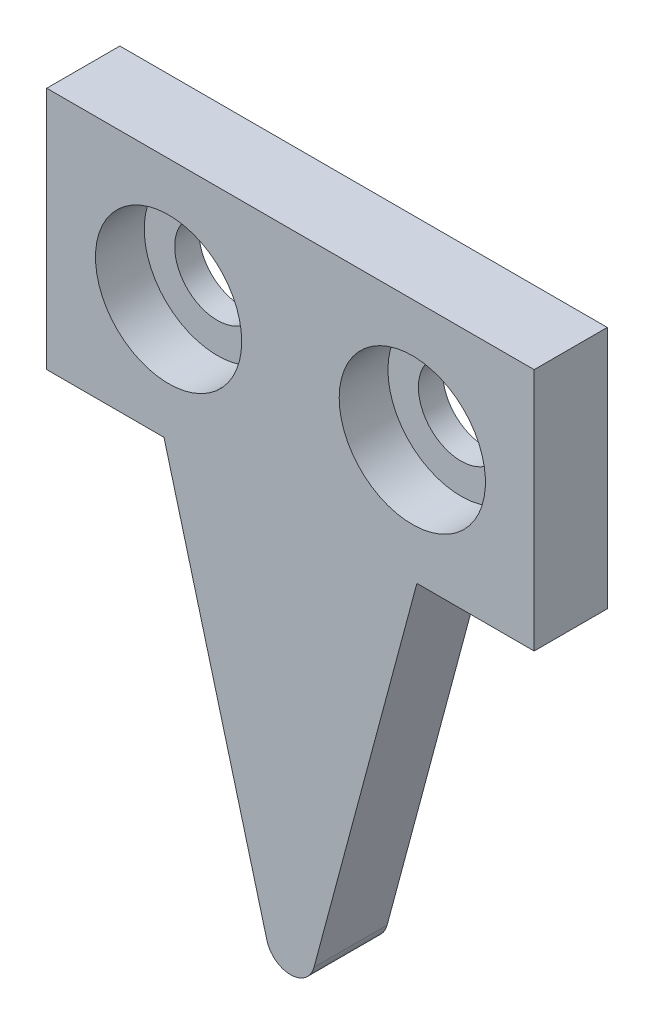
ISO-10303-21;
HEADER;
FILE_DESCRIPTION(('STEP AP214'),'2;1');
FILE_NAME('part.step','',(''),(''),'','','');
FILE_SCHEMA(('AUTOMOTIVE_DESIGN { 1 0 10303 214 1 1 1 1 }'));
ENDSEC;
DATA;
#1=APPLICATION_CONTEXT('core data for automotive mechanical design processes');
#2=APPLICATION_PROTOCOL_DEFINITION('international standard','automotive_design',2000,#1);
#3=PRODUCT_CONTEXT('',#1,'mechanical');
#4=PRODUCT('Part','Part','',(#3));
#5=PRODUCT_RELATED_PRODUCT_CATEGORY('part','',(#4));
#6=PRODUCT_DEFINITION_FORMATION('','',#4);
#7=PRODUCT_DEFINITION_CONTEXT('part definition',#1,'design');
#8=PRODUCT_DEFINITION('design','',#6,#7);
#9=PRODUCT_DEFINITION_SHAPE('','',#8);
#10=(LENGTH_UNIT() NAMED_UNIT(*) SI_UNIT(.MILLI.,.METRE.));
#11=(NAMED_UNIT(*) PLANE_ANGLE_UNIT() SI_UNIT($,.RADIAN.));
#12=(NAMED_UNIT(*) SI_UNIT($,.STERADIAN.) SOLID_ANGLE_UNIT());
#13=UNCERTAINTY_MEASURE_WITH_UNIT(LENGTH_MEASURE(1.E-05),#10,'distance_accuracy_value','');
#14=(GEOMETRIC_REPRESENTATION_CONTEXT(3) GLOBAL_UNCERTAINTY_ASSIGNED_CONTEXT((#13)) GLOBAL_UNIT_ASSIGNED_CONTEXT((#10,
#11,#12)) REPRESENTATION_CONTEXT('',''));
#15=CARTESIAN_POINT('',(0.,0.,0.));
#16=DIRECTION('',(0.,0.,1.));
#17=DIRECTION('',(1.,0.,0.));
#18=AXIS2_PLACEMENT_3D('',#15,#16,#17);
#19=CARTESIAN_POINT('',(-5.,20.5,-4.94974746830585));
#20=DIRECTION('',(0.,0.,1.));
#21=DIRECTION('',(1.,0.,0.));
#22=AXIS2_PLACEMENT_3D('',#19,#20,#21);
#23=CYLINDRICAL_SURFACE('',#22,1.75);
#24=CARTESIAN_POINT('',(-5.,20.5,0.));
#25=DIRECTION('',(0.,0.,1.));
#26=DIRECTION('',(1.,0.,0.));
#27=AXIS2_PLACEMENT_3D('',#24,#25,#26);
#28=CIRCLE('',#27,1.75);
#29=CARTESIAN_POINT('',(-3.25,20.5,0.));
#30=VERTEX_POINT('',#29);
#31=EDGE_CURVE('E145',#30,#30,#28,.F.);
#32=ORIENTED_EDGE('',*,*,#31,.T.);
#33=EDGE_LOOP('',(#32));
#34=FACE_BOUND('',#33,.T.);
#35=CARTESIAN_POINT('',(-5.,20.5,1.));
#36=DIRECTION('',(0.,0.,1.));
#37=DIRECTION('',(1.,0.,0.));
#38=AXIS2_PLACEMENT_3D('',#35,#36,#37);
#39=CIRCLE('',#38,1.75);
#40=CARTESIAN_POINT('',(-3.25,20.5,1.));
#41=VERTEX_POINT('',#40);
#42=EDGE_CURVE('E165',#41,#41,#39,.F.);
#43=ORIENTED_EDGE('',*,*,#42,.F.);
#44=EDGE_LOOP('',(#43));
#45=FACE_BOUND('',#44,.T.);
#46=ADVANCED_FACE('F39',(#34,#45),#23,.F.);
#47=CARTESIAN_POINT('',(10.,15.5,3.));
#48=DIRECTION('',(-1.,0.,0.));
#49=DIRECTION('',(0.,0.,1.));
#50=AXIS2_PLACEMENT_3D('',#47,#48,#49);
#51=PLANE('',#50);
#52=DIRECTION('',(0.,1.,0.));
#53=VECTOR('',#52,1.);
#54=CARTESIAN_POINT('',(10.,15.5,0.));
#55=LINE('',#54,#53);
#56=CARTESIAN_POINT('',(10.,15.5,0.));
#57=VERTEX_POINT('',#56);
#58=CARTESIAN_POINT('',(10.,25.5,0.));
#59=VERTEX_POINT('',#58);
#60=EDGE_CURVE('E140',#57,#59,#55,.T.);
#61=ORIENTED_EDGE('',*,*,#60,.T.);
#62=DIRECTION('',(0.,0.,-1.));
#63=VECTOR('',#62,1.);
#64=CARTESIAN_POINT('',(10.,25.5,3.));
#65=LINE('',#64,#63);
#66=CARTESIAN_POINT('',(10.,25.5,3.));
#67=VERTEX_POINT('',#66);
#68=EDGE_CURVE('E11',#67,#59,#65,.T.);
#69=ORIENTED_EDGE('',*,*,#68,.F.);
#70=DIRECTION('',(0.,1.,0.));
#71=VECTOR('',#70,1.);
#72=CARTESIAN_POINT('',(10.,15.5,3.));
#73=LINE('',#72,#71);
#74=CARTESIAN_POINT('',(10.,15.5,3.));
#75=VERTEX_POINT('',#74);
#76=EDGE_CURVE('E154',#75,#67,#73,.T.);
#77=ORIENTED_EDGE('',*,*,#76,.F.);
#78=DIRECTION('',(0.,0.,-1.));
#79=VECTOR('',#78,1.);
#80=CARTESIAN_POINT('',(10.,15.5,3.));
#81=LINE('',#80,#79);
#82=EDGE_CURVE('E133',#75,#57,#81,.T.);
#83=ORIENTED_EDGE('',*,*,#82,.T.);
#84=EDGE_LOOP('',(#61,#69,#77,#83));
#85=FACE_BOUND('',#84,.T.);
#86=ADVANCED_FACE('F41',(#85),#51,.F.);
#87=CARTESIAN_POINT('',(-10.,25.5,3.));
#88=DIRECTION('',(0.,-1.,0.));
#89=DIRECTION('',(0.,0.,-1.));
#90=AXIS2_PLACEMENT_3D('',#87,#88,#89);
#91=PLANE('',#90);
#92=DIRECTION('',(-1.,0.,0.));
#93=VECTOR('',#92,1.);
#94=CARTESIAN_POINT('',(-10.,25.5,0.));
#95=LINE('',#94,#93);
#96=CARTESIAN_POINT('',(-10.,25.5,0.));
#97=VERTEX_POINT('',#96);
#98=EDGE_CURVE('E142',#59,#97,#95,.T.);
#99=ORIENTED_EDGE('',*,*,#98,.T.);
#100=DIRECTION('',(0.,0.,-1.));
#101=VECTOR('',#100,1.);
#102=CARTESIAN_POINT('',(-10.,25.5,3.));
#103=LINE('',#102,#101);
#104=CARTESIAN_POINT('',(-10.,25.5,3.));
#105=VERTEX_POINT('',#104);
#106=EDGE_CURVE('E47',#105,#97,#103,.T.);
#107=ORIENTED_EDGE('',*,*,#106,.F.);
#108=DIRECTION('',(-1.,0.,0.));
#109=VECTOR('',#108,1.);
#110=CARTESIAN_POINT('',(-10.,25.5,3.));
#111=LINE('',#110,#109);
#112=EDGE_CURVE('E103',#67,#105,#111,.T.);
#113=ORIENTED_EDGE('',*,*,#112,.F.);
#114=ORIENTED_EDGE('',*,*,#68,.T.);
#115=EDGE_LOOP('',(#99,#107,#113,#114));
#116=FACE_BOUND('',#115,.T.);
#117=ADVANCED_FACE('F230',(#116),#91,.F.);
#118=CARTESIAN_POINT('',(-10.,15.5,3.));
#119=DIRECTION('',(1.,0.,0.));
#120=DIRECTION('',(0.,0.,-1.));
#121=AXIS2_PLACEMENT_3D('',#118,#119,#120);
#122=PLANE('',#121);
#123=DIRECTION('',(0.,-1.,0.));
#124=VECTOR('',#123,1.);
#125=CARTESIAN_POINT('',(-10.,15.5,0.));
#126=LINE('',#125,#124);
#127=CARTESIAN_POINT('',(-10.,15.5,0.));
#128=VERTEX_POINT('',#127);
#129=EDGE_CURVE('E144',#97,#128,#126,.T.);
#130=ORIENTED_EDGE('',*,*,#129,.T.);
#131=DIRECTION('',(0.,0.,-1.));
#132=VECTOR('',#131,1.);
#133=CARTESIAN_POINT('',(-10.,15.5,3.));
#134=LINE('',#133,#132);
#135=CARTESIAN_POINT('',(-10.,15.5,3.));
#136=VERTEX_POINT('',#135);
#137=EDGE_CURVE('E158',#136,#128,#134,.T.);
#138=ORIENTED_EDGE('',*,*,#137,.F.);
#139=DIRECTION('',(0.,-1.,0.));
#140=VECTOR('',#139,1.);
#141=CARTESIAN_POINT('',(-10.,15.5,3.));
#142=LINE('',#141,#140);
#143=EDGE_CURVE('E192',#105,#136,#142,.T.);
#144=ORIENTED_EDGE('',*,*,#143,.F.);
#145=ORIENTED_EDGE('',*,*,#106,.T.);
#146=EDGE_LOOP('',(#130,#138,#144,#145));
#147=FACE_BOUND('',#146,.T.);
#148=ADVANCED_FACE('F342',(#147),#122,.F.);
#149=CARTESIAN_POINT('',(-5.18848866309256,15.5,3.));
#150=DIRECTION('',(0.,1.,0.));
#151=DIRECTION('',(0.,0.,1.));
#152=AXIS2_PLACEMENT_3D('',#149,#150,#151);
#153=PLANE('',#152);
#154=DIRECTION('',(1.,0.,0.));
#155=VECTOR('',#154,1.);
#156=CARTESIAN_POINT('',(-5.18848866309256,15.5,0.));
#157=LINE('',#156,#155);
#158=CARTESIAN_POINT('',(-5.18848866309256,15.5,0.));
#159=VERTEX_POINT('',#158);
#160=EDGE_CURVE('E147',#128,#159,#157,.T.);
#161=ORIENTED_EDGE('',*,*,#160,.T.);
#162=DIRECTION('',(0.,0.,-1.));
#163=VECTOR('',#162,1.);
#164=CARTESIAN_POINT('',(-5.18848866309256,15.5,3.));
#165=LINE('',#164,#163);
#166=CARTESIAN_POINT('',(-5.18848866309256,15.5,3.));
#167=VERTEX_POINT('',#166);
#168=EDGE_CURVE('E159',#167,#159,#165,.T.);
#169=ORIENTED_EDGE('',*,*,#168,.F.);
#170=DIRECTION('',(1.,0.,0.));
#171=VECTOR('',#170,1.);
#172=CARTESIAN_POINT('',(-5.18848866309256,15.5,3.));
#173=LINE('',#172,#171);
#174=EDGE_CURVE('E194',#136,#167,#173,.T.);
#175=ORIENTED_EDGE('',*,*,#174,.F.);
#176=ORIENTED_EDGE('',*,*,#137,.T.);
#177=EDGE_LOOP('',(#161,#169,#175,#176));
#178=FACE_BOUND('',#177,.T.);
#179=ADVANCED_FACE('F198',(#178),#153,.F.);
#180=CARTESIAN_POINT('',(-5.18848866309256,15.5,3.));
#181=DIRECTION('',(0.965925826289067,0.258819045102525,0.));
#182=DIRECTION('',(-0.258819045102525,0.965925826289067,0.));
#183=AXIS2_PLACEMENT_3D('',#180,#181,#182);
#184=PLANE('',#183);
#185=DIRECTION('',(0.258819045102525,-0.965925826289067,0.));
#186=VECTOR('',#185,1.);
#187=CARTESIAN_POINT('',(-5.18848866309256,15.5,0.));
#188=LINE('',#187,#186);
#189=CARTESIAN_POINT('',(-0.965925826289066,-0.258819045102525,0.));
#190=VERTEX_POINT('',#189);
#191=EDGE_CURVE('E149',#159,#190,#188,.T.);
#192=ORIENTED_EDGE('',*,*,#191,.T.);
#193=DIRECTION('',(0.,0.,-1.));
#194=VECTOR('',#193,1.);
#195=CARTESIAN_POINT('',(-0.965925826289066,-0.258819045102525,3.));
#196=LINE('',#195,#194);
#197=CARTESIAN_POINT('',(-0.965925826289066,-0.258819045102525,3.));
#198=VERTEX_POINT('',#197);
#199=EDGE_CURVE('E126',#198,#190,#196,.T.);
#200=ORIENTED_EDGE('',*,*,#199,.F.);
#201=DIRECTION('',(0.258819045102525,-0.965925826289067,0.));
#202=VECTOR('',#201,1.);
#203=CARTESIAN_POINT('',(-5.18848866309256,15.5,3.));
#204=LINE('',#203,#202);
#205=EDGE_CURVE('E119',#167,#198,#204,.T.);
#206=ORIENTED_EDGE('',*,*,#205,.F.);
#207=ORIENTED_EDGE('',*,*,#168,.T.);
#208=EDGE_LOOP('',(#192,#200,#206,#207));
#209=FACE_BOUND('',#208,.T.);
#210=ADVANCED_FACE('F205',(#209),#184,.F.);
#211=CARTESIAN_POINT('',(0.,0.,3.));
#212=DIRECTION('',(0.,0.,-1.));
#213=DIRECTION('',(-1.,0.,0.));
#214=AXIS2_PLACEMENT_3D('',#211,#212,#213);
#215=CYLINDRICAL_SURFACE('',#214,0.999999999999999);
#216=CARTESIAN_POINT('',(0.,0.,0.));
#217=DIRECTION('',(0.,0.,1.));
#218=DIRECTION('',(1.,0.,0.));
#219=AXIS2_PLACEMENT_3D('',#216,#217,#218);
#220=CIRCLE('',#219,0.999999999999999);
#221=CARTESIAN_POINT('',(0.965925826289066,-0.258819045102525,0.));
#222=VERTEX_POINT('',#221);
#223=EDGE_CURVE('E129',#190,#222,#220,.T.);
#224=ORIENTED_EDGE('',*,*,#223,.T.);
#225=DIRECTION('',(0.,0.,-1.));
#226=VECTOR('',#225,1.);
#227=CARTESIAN_POINT('',(0.965925826289066,-0.258819045102525,3.));
#228=LINE('',#227,#226);
#229=CARTESIAN_POINT('',(0.965925826289066,-0.258819045102525,3.));
#230=VERTEX_POINT('',#229);
#231=EDGE_CURVE('E123',#230,#222,#228,.T.);
#232=ORIENTED_EDGE('',*,*,#231,.F.);
#233=CARTESIAN_POINT('',(0.,0.,3.));
#234=DIRECTION('',(0.,0.,1.));
#235=DIRECTION('',(1.,0.,0.));
#236=AXIS2_PLACEMENT_3D('',#233,#234,#235);
#237=CIRCLE('',#236,0.999999999999999);
#238=EDGE_CURVE('E112',#198,#230,#237,.T.);
#239=ORIENTED_EDGE('',*,*,#238,.F.);
#240=ORIENTED_EDGE('',*,*,#199,.T.);
#241=EDGE_LOOP('',(#224,#232,#239,#240));
#242=FACE_BOUND('',#241,.T.);
#243=ADVANCED_FACE('F127',(#242),#215,.T.);
#244=CARTESIAN_POINT('',(5.18848866309256,15.5,3.));
#245=DIRECTION('',(-0.965925826289067,0.258819045102525,0.));
#246=DIRECTION('',(-0.258819045102525,-0.965925826289067,0.));
#247=AXIS2_PLACEMENT_3D('',#244,#245,#246);
#248=PLANE('',#247);
#249=DIRECTION('',(0.258819045102525,0.965925826289067,0.));
#250=VECTOR('',#249,1.);
#251=CARTESIAN_POINT('',(5.18848866309256,15.5,0.));
#252=LINE('',#251,#250);
#253=CARTESIAN_POINT('',(5.18848866309256,15.5,0.));
#254=VERTEX_POINT('',#253);
#255=EDGE_CURVE('E87',#222,#254,#252,.T.);
#256=ORIENTED_EDGE('',*,*,#255,.T.);
#257=DIRECTION('',(0.,0.,-1.));
#258=VECTOR('',#257,1.);
#259=CARTESIAN_POINT('',(5.18848866309256,15.5,3.));
#260=LINE('',#259,#258);
#261=CARTESIAN_POINT('',(5.18848866309256,15.5,3.));
#262=VERTEX_POINT('',#261);
#263=EDGE_CURVE('E128',#262,#254,#260,.T.);
#264=ORIENTED_EDGE('',*,*,#263,.F.);
#265=DIRECTION('',(0.258819045102525,0.965925826289067,0.));
#266=VECTOR('',#265,1.);
#267=CARTESIAN_POINT('',(5.18848866309256,15.5,3.));
#268=LINE('',#267,#266);
#269=EDGE_CURVE('E117',#230,#262,#268,.T.);
#270=ORIENTED_EDGE('',*,*,#269,.F.);
#271=ORIENTED_EDGE('',*,*,#231,.T.);
#272=EDGE_LOOP('',(#256,#264,#270,#271));
#273=FACE_BOUND('',#272,.T.);
#274=ADVANCED_FACE('F132',(#273),#248,.F.);
#275=CARTESIAN_POINT('',(5.18848866309256,15.5,3.));
#276=DIRECTION('',(0.,1.,0.));
#277=DIRECTION('',(0.,0.,1.));
#278=AXIS2_PLACEMENT_3D('',#275,#276,#277);
#279=PLANE('',#278);
#280=DIRECTION('',(1.,0.,0.));
#281=VECTOR('',#280,1.);
#282=CARTESIAN_POINT('',(5.18848866309256,15.5,0.));
#283=LINE('',#282,#281);
#284=EDGE_CURVE('E95',#254,#57,#283,.T.);
#285=ORIENTED_EDGE('',*,*,#284,.T.);
#286=ORIENTED_EDGE('',*,*,#82,.F.);
#287=DIRECTION('',(1.,0.,0.));
#288=VECTOR('',#287,1.);
#289=CARTESIAN_POINT('',(5.18848866309256,15.5,3.));
#290=LINE('',#289,#288);
#291=EDGE_CURVE('E59',#262,#75,#290,.T.);
#292=ORIENTED_EDGE('',*,*,#291,.F.);
#293=ORIENTED_EDGE('',*,*,#263,.T.);
#294=EDGE_LOOP('',(#285,#286,#292,#293));
#295=FACE_BOUND('',#294,.T.);
#296=ADVANCED_FACE('F212',(#295),#279,.F.);
#297=CARTESIAN_POINT('',(0.,0.,3.));
#298=DIRECTION('',(0.,0.,1.));
#299=DIRECTION('',(1.,0.,0.));
#300=AXIS2_PLACEMENT_3D('',#297,#298,#299);
#301=PLANE('',#300);
#302=CARTESIAN_POINT('',(-5.,20.5,3.));
#303=DIRECTION('',(0.,0.,1.));
#304=DIRECTION('',(1.,0.,0.));
#305=AXIS2_PLACEMENT_3D('',#302,#303,#304);
#306=CIRCLE('',#305,3.);
#307=CARTESIAN_POINT('',(-2.,20.5,3.));
#308=VERTEX_POINT('',#307);
#309=EDGE_CURVE('E175',#308,#308,#306,.T.);
#310=ORIENTED_EDGE('',*,*,#309,.F.);
#311=EDGE_LOOP('',(#310));
#312=FACE_BOUND('',#311,.T.);
#313=CARTESIAN_POINT('',(5.,20.5,3.));
#314=DIRECTION('',(0.,0.,1.));
#315=DIRECTION('',(-1.,0.,0.));
#316=AXIS2_PLACEMENT_3D('',#313,#314,#315);
#317=CIRCLE('',#316,3.);
#318=CARTESIAN_POINT('',(2.,20.5,3.));
#319=VERTEX_POINT('',#318);
#320=EDGE_CURVE('E180',#319,#319,#317,.T.);
#321=ORIENTED_EDGE('',*,*,#320,.F.);
#322=EDGE_LOOP('',(#321));
#323=FACE_BOUND('',#322,.T.);
#324=ORIENTED_EDGE('',*,*,#76,.T.);
#325=ORIENTED_EDGE('',*,*,#112,.T.);
#326=ORIENTED_EDGE('',*,*,#143,.T.);
#327=ORIENTED_EDGE('',*,*,#174,.T.);
#328=ORIENTED_EDGE('',*,*,#205,.T.);
#329=ORIENTED_EDGE('',*,*,#238,.T.);
#330=ORIENTED_EDGE('',*,*,#269,.T.);
#331=ORIENTED_EDGE('',*,*,#291,.T.);
#332=EDGE_LOOP('',(#324,#325,#326,#327,#328,#329,#330,#331));
#333=FACE_BOUND('',#332,.T.);
#334=ADVANCED_FACE('F116',(#312,#323,#333),#301,.T.);
#335=CARTESIAN_POINT('',(0.,0.,0.));
#336=DIRECTION('',(0.,0.,1.));
#337=DIRECTION('',(1.,0.,0.));
#338=AXIS2_PLACEMENT_3D('',#335,#336,#337);
#339=PLANE('',#338);
#340=ORIENTED_EDGE('',*,*,#31,.F.);
#341=EDGE_LOOP('',(#340));
#342=FACE_BOUND('',#341,.T.);
#343=CARTESIAN_POINT('',(5.,20.5,0.));
#344=DIRECTION('',(0.,0.,1.));
#345=DIRECTION('',(1.,0.,0.));
#346=AXIS2_PLACEMENT_3D('',#343,#344,#345);
#347=CIRCLE('',#346,1.75);
#348=CARTESIAN_POINT('',(6.75000000000001,20.5,0.));
#349=VERTEX_POINT('',#348);
#350=EDGE_CURVE('E167',#349,#349,#347,.F.);
#351=ORIENTED_EDGE('',*,*,#350,.F.);
#352=EDGE_LOOP('',(#351));
#353=FACE_BOUND('',#352,.T.);
#354=ORIENTED_EDGE('',*,*,#60,.F.);
#355=ORIENTED_EDGE('',*,*,#284,.F.);
#356=ORIENTED_EDGE('',*,*,#255,.F.);
#357=ORIENTED_EDGE('',*,*,#223,.F.);
#358=ORIENTED_EDGE('',*,*,#191,.F.);
#359=ORIENTED_EDGE('',*,*,#160,.F.);
#360=ORIENTED_EDGE('',*,*,#129,.F.);
#361=ORIENTED_EDGE('',*,*,#98,.F.);
#362=EDGE_LOOP('',(#354,#355,#356,#357,#358,#359,#360,#361));
#363=FACE_BOUND('',#362,.T.);
#364=ADVANCED_FACE('F207',(#342,#353,#363),#339,.F.);
#365=CARTESIAN_POINT('',(5.,20.5,-4.94974746830585));
#366=DIRECTION('',(0.,0.,1.));
#367=DIRECTION('',(1.,0.,0.));
#368=AXIS2_PLACEMENT_3D('',#365,#366,#367);
#369=CYLINDRICAL_SURFACE('',#368,1.75);
#370=CARTESIAN_POINT('',(5.,20.5,1.));
#371=DIRECTION('',(0.,0.,-1.));
#372=DIRECTION('',(-1.,0.,0.));
#373=AXIS2_PLACEMENT_3D('',#370,#371,#372);
#374=CIRCLE('',#373,1.75);
#375=CARTESIAN_POINT('',(3.25,20.5,1.));
#376=VERTEX_POINT('',#375);
#377=EDGE_CURVE('E43',#376,#376,#374,.F.);
#378=ORIENTED_EDGE('',*,*,#377,.T.);
#379=EDGE_LOOP('',(#378));
#380=FACE_BOUND('',#379,.T.);
#381=ORIENTED_EDGE('',*,*,#350,.T.);
#382=EDGE_LOOP('',(#381));
#383=FACE_BOUND('',#382,.T.);
#384=ADVANCED_FACE('F232',(#380,#383),#369,.F.);
#385=CARTESIAN_POINT('',(-5.,20.5,1.));
#386=DIRECTION('',(0.,0.,1.));
#387=DIRECTION('',(1.,0.,0.));
#388=AXIS2_PLACEMENT_3D('',#385,#386,#387);
#389=PLANE('',#388);
#390=CARTESIAN_POINT('',(-5.,20.5,1.));
#391=DIRECTION('',(0.,0.,1.));
#392=DIRECTION('',(1.,0.,0.));
#393=AXIS2_PLACEMENT_3D('',#390,#391,#392);
#394=CIRCLE('',#393,3.);
#395=CARTESIAN_POINT('',(-2.,20.5,1.));
#396=VERTEX_POINT('',#395);
#397=EDGE_CURVE('E168',#396,#396,#394,.T.);
#398=ORIENTED_EDGE('',*,*,#397,.T.);
#399=EDGE_LOOP('',(#398));
#400=FACE_BOUND('',#399,.T.);
#401=ORIENTED_EDGE('',*,*,#42,.T.);
#402=EDGE_LOOP('',(#401));
#403=FACE_BOUND('',#402,.T.);
#404=ADVANCED_FACE('F240',(#400,#403),#389,.T.);
#405=CARTESIAN_POINT('',(-5.,20.5,1.));
#406=DIRECTION('',(0.,0.,1.));
#407=DIRECTION('',(1.,0.,0.));
#408=AXIS2_PLACEMENT_3D('',#405,#406,#407);
#409=CYLINDRICAL_SURFACE('',#408,3.);
#410=ORIENTED_EDGE('',*,*,#397,.F.);
#411=EDGE_LOOP('',(#410));
#412=FACE_BOUND('',#411,.T.);
#413=ORIENTED_EDGE('',*,*,#309,.T.);
#414=EDGE_LOOP('',(#413));
#415=FACE_BOUND('',#414,.T.);
#416=ADVANCED_FACE('F268',(#412,#415),#409,.F.);
#417=CARTESIAN_POINT('',(5.,20.5,1.));
#418=DIRECTION('',(0.,0.,-1.));
#419=DIRECTION('',(-1.,0.,0.));
#420=AXIS2_PLACEMENT_3D('',#417,#418,#419);
#421=PLANE('',#420);
#422=CARTESIAN_POINT('',(5.,20.5,1.));
#423=DIRECTION('',(0.,0.,1.));
#424=DIRECTION('',(-1.,0.,0.));
#425=AXIS2_PLACEMENT_3D('',#422,#423,#424);
#426=CIRCLE('',#425,3.);
#427=CARTESIAN_POINT('',(2.,20.5,1.));
#428=VERTEX_POINT('',#427);
#429=EDGE_CURVE('E185',#428,#428,#426,.T.);
#430=ORIENTED_EDGE('',*,*,#429,.T.);
#431=EDGE_LOOP('',(#430));
#432=FACE_BOUND('',#431,.T.);
#433=ORIENTED_EDGE('',*,*,#377,.F.);
#434=EDGE_LOOP('',(#433));
#435=FACE_BOUND('',#434,.T.);
#436=ADVANCED_FACE('F231',(#432,#435),#421,.F.);
#437=CARTESIAN_POINT('',(5.,20.5,1.));
#438=DIRECTION('',(0.,0.,1.));
#439=DIRECTION('',(1.,0.,0.));
#440=AXIS2_PLACEMENT_3D('',#437,#438,#439);
#441=CYLINDRICAL_SURFACE('',#440,3.);
#442=ORIENTED_EDGE('',*,*,#429,.F.);
#443=EDGE_LOOP('',(#442));
#444=FACE_BOUND('',#443,.T.);
#445=ORIENTED_EDGE('',*,*,#320,.T.);
#446=EDGE_LOOP('',(#445));
#447=FACE_BOUND('',#446,.T.);
#448=ADVANCED_FACE('F290',(#444,#447),#441,.F.);
#449=CLOSED_SHELL('',(#46,#86,#117,#148,#179,#210,#243,#274,#296,#334,#364,#384,#404,#416,#436,#448));
#450=MANIFOLD_SOLID_BREP('B2',#449);
#451=ADVANCED_BREP_SHAPE_REPRESENTATION('',(#18,#450),#14);
#452=SHAPE_DEFINITION_REPRESENTATION(#9,#451);
ENDSEC;
END-ISO-10303-21;
